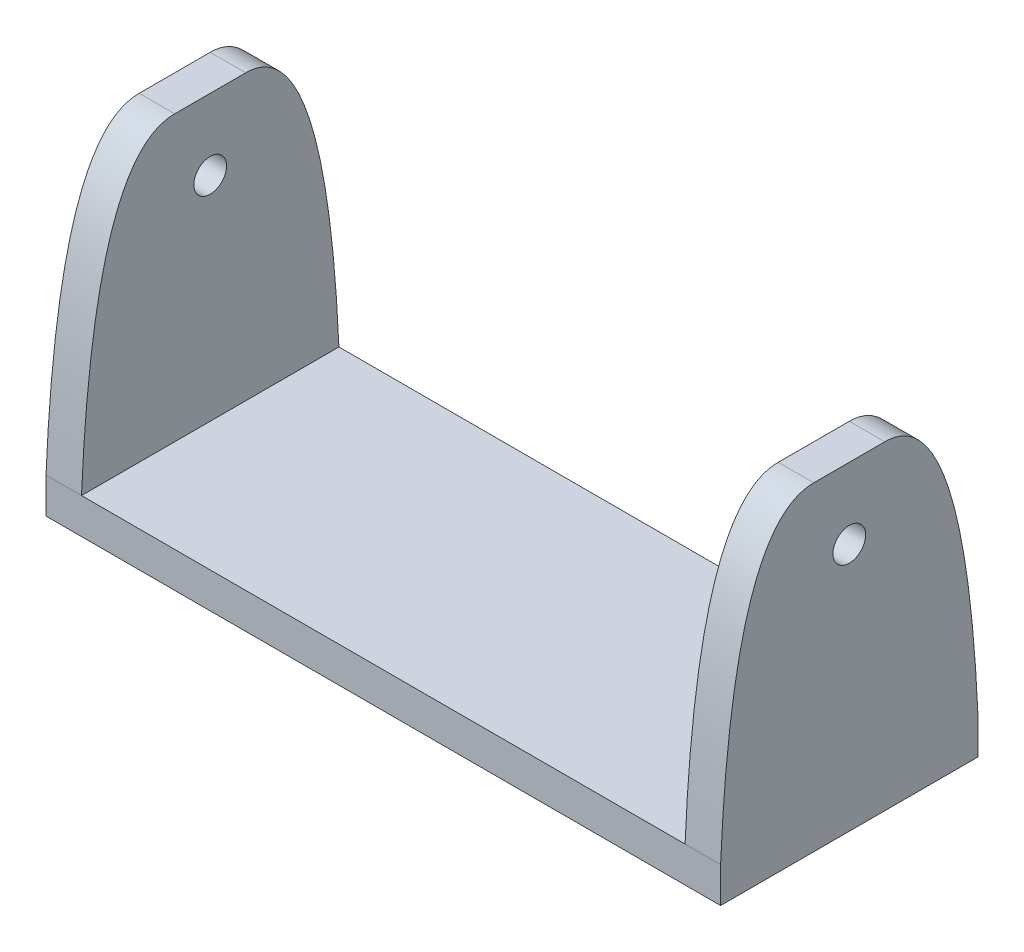
ISO-10303-21;
HEADER;
FILE_DESCRIPTION(('STEP AP214'),'2;1');
FILE_NAME('part.step','',(''),(''),'','','');
FILE_SCHEMA(('AUTOMOTIVE_DESIGN { 1 0 10303 214 1 1 1 1 }'));
ENDSEC;
DATA;
#1=APPLICATION_CONTEXT('core data for automotive mechanical design processes');
#2=APPLICATION_PROTOCOL_DEFINITION('international standard','automotive_design',2000,#1);
#3=PRODUCT_CONTEXT('',#1,'mechanical');
#4=PRODUCT('Part','Part','',(#3));
#5=PRODUCT_RELATED_PRODUCT_CATEGORY('part','',(#4));
#6=PRODUCT_DEFINITION_FORMATION('','',#4);
#7=PRODUCT_DEFINITION_CONTEXT('part definition',#1,'design');
#8=PRODUCT_DEFINITION('design','',#6,#7);
#9=PRODUCT_DEFINITION_SHAPE('','',#8);
#10=(LENGTH_UNIT() NAMED_UNIT(*) SI_UNIT(.MILLI.,.METRE.));
#11=(NAMED_UNIT(*) PLANE_ANGLE_UNIT() SI_UNIT($,.RADIAN.));
#12=(NAMED_UNIT(*) SI_UNIT($,.STERADIAN.) SOLID_ANGLE_UNIT());
#13=UNCERTAINTY_MEASURE_WITH_UNIT(LENGTH_MEASURE(1.E-05),#10,'distance_accuracy_value','');
#14=(GEOMETRIC_REPRESENTATION_CONTEXT(3) GLOBAL_UNCERTAINTY_ASSIGNED_CONTEXT((#13)) GLOBAL_UNIT_ASSIGNED_CONTEXT((#10,
#11,#12)) REPRESENTATION_CONTEXT('',''));
#15=CARTESIAN_POINT('',(0.,0.,0.));
#16=DIRECTION('',(0.,0.,1.));
#17=DIRECTION('',(1.,0.,0.));
#18=AXIS2_PLACEMENT_3D('',#15,#16,#17);
#19=CARTESIAN_POINT('',(0.,36.,0.));
#20=DIRECTION('',(0.,1.,0.));
#21=DIRECTION('',(0.,0.,1.));
#22=AXIS2_PLACEMENT_3D('',#19,#20,#21);
#23=PLANE('',#22);
#24=DIRECTION('',(-1.,0.,0.));
#25=VECTOR('',#24,1.);
#26=CARTESIAN_POINT('',(71.6786282380978,36.,3.99999999999999));
#27=LINE('',#26,#25);
#28=CARTESIAN_POINT('',(-34.,36.,3.99999999999998));
#29=VERTEX_POINT('',#28);
#30=CARTESIAN_POINT('',(-38.,36.,3.99999999999999));
#31=VERTEX_POINT('',#30);
#32=EDGE_CURVE('E119',#29,#31,#27,.T.);
#33=ORIENTED_EDGE('',*,*,#32,.F.);
#34=DIRECTION('',(0.,0.,-1.));
#35=VECTOR('',#34,1.);
#36=CARTESIAN_POINT('',(-34.,36.,-14.5));
#37=LINE('',#36,#35);
#38=CARTESIAN_POINT('',(-34.,36.,-4.));
#39=VERTEX_POINT('',#38);
#40=EDGE_CURVE('E166',#29,#39,#37,.T.);
#41=ORIENTED_EDGE('',*,*,#40,.T.);
#42=DIRECTION('',(-1.,0.,0.));
#43=VECTOR('',#42,1.);
#44=CARTESIAN_POINT('',(71.6786282380978,36.,-4.));
#45=LINE('',#44,#43);
#46=CARTESIAN_POINT('',(-38.,36.,-4.));
#47=VERTEX_POINT('',#46);
#48=EDGE_CURVE('E234',#39,#47,#45,.T.);
#49=ORIENTED_EDGE('',*,*,#48,.T.);
#50=DIRECTION('',(0.,0.,1.));
#51=VECTOR('',#50,1.);
#52=CARTESIAN_POINT('',(-38.,36.,-14.5));
#53=LINE('',#52,#51);
#54=EDGE_CURVE('E176',#47,#31,#53,.T.);
#55=ORIENTED_EDGE('',*,*,#54,.T.);
#56=EDGE_LOOP('',(#33,#41,#49,#55));
#57=FACE_BOUND('',#56,.T.);
#58=ADVANCED_FACE('F39',(#57),#23,.T.);
#59=CARTESIAN_POINT('',(0.,36.,0.));
#60=DIRECTION('',(0.,-1.,0.));
#61=DIRECTION('',(0.,0.,-1.));
#62=AXIS2_PLACEMENT_3D('',#59,#60,#61);
#63=PLANE('',#62);
#64=CARTESIAN_POINT('',(38.,36.,3.99999999999998));
#65=VERTEX_POINT('',#64);
#66=CARTESIAN_POINT('',(34.,36.,3.99999999999999));
#67=VERTEX_POINT('',#66);
#68=EDGE_CURVE('E324',#65,#67,#27,.T.);
#69=ORIENTED_EDGE('',*,*,#68,.F.);
#70=DIRECTION('',(0.,0.,-1.));
#71=VECTOR('',#70,1.);
#72=CARTESIAN_POINT('',(38.,36.,-14.5));
#73=LINE('',#72,#71);
#74=CARTESIAN_POINT('',(38.,36.,-4.));
#75=VERTEX_POINT('',#74);
#76=EDGE_CURVE('E187',#65,#75,#73,.T.);
#77=ORIENTED_EDGE('',*,*,#76,.T.);
#78=CARTESIAN_POINT('',(34.,36.,-4.));
#79=VERTEX_POINT('',#78);
#80=EDGE_CURVE('E226',#75,#79,#45,.T.);
#81=ORIENTED_EDGE('',*,*,#80,.T.);
#82=DIRECTION('',(0.,0.,1.));
#83=VECTOR('',#82,1.);
#84=CARTESIAN_POINT('',(34.,36.,-14.5));
#85=LINE('',#84,#83);
#86=EDGE_CURVE('E177',#79,#67,#85,.T.);
#87=ORIENTED_EDGE('',*,*,#86,.T.);
#88=EDGE_LOOP('',(#69,#77,#81,#87));
#89=FACE_BOUND('',#88,.T.);
#90=ADVANCED_FACE('F264',(#89),#63,.F.);
#91=CARTESIAN_POINT('',(0.,4.,0.));
#92=DIRECTION('',(0.,1.,0.));
#93=DIRECTION('',(0.,0.,1.));
#94=AXIS2_PLACEMENT_3D('',#91,#92,#93);
#95=PLANE('',#94);
#96=DIRECTION('',(1.,0.,0.));
#97=VECTOR('',#96,1.);
#98=CARTESIAN_POINT('',(-38.,4.,14.5));
#99=LINE('',#98,#97);
#100=CARTESIAN_POINT('',(-34.,4.00000000000001,14.5));
#101=VERTEX_POINT('',#100);
#102=CARTESIAN_POINT('',(34.,4.00000000000001,14.5));
#103=VERTEX_POINT('',#102);
#104=EDGE_CURVE('E136',#101,#103,#99,.T.);
#105=ORIENTED_EDGE('',*,*,#104,.T.);
#106=DIRECTION('',(0.,0.,1.));
#107=VECTOR('',#106,1.);
#108=CARTESIAN_POINT('',(34.,4.,-14.5));
#109=LINE('',#108,#107);
#110=CARTESIAN_POINT('',(34.,4.,-14.5));
#111=VERTEX_POINT('',#110);
#112=EDGE_CURVE('E183',#111,#103,#109,.T.);
#113=ORIENTED_EDGE('',*,*,#112,.F.);
#114=DIRECTION('',(-1.,0.,0.));
#115=VECTOR('',#114,1.);
#116=CARTESIAN_POINT('',(-38.,4.,-14.5));
#117=LINE('',#116,#115);
#118=CARTESIAN_POINT('',(-34.,4.,-14.5));
#119=VERTEX_POINT('',#118);
#120=EDGE_CURVE('E155',#111,#119,#117,.T.);
#121=ORIENTED_EDGE('',*,*,#120,.T.);
#122=DIRECTION('',(0.,0.,-1.));
#123=VECTOR('',#122,1.);
#124=CARTESIAN_POINT('',(-34.,4.,-14.5));
#125=LINE('',#124,#123);
#126=EDGE_CURVE('E172',#101,#119,#125,.T.);
#127=ORIENTED_EDGE('',*,*,#126,.F.);
#128=EDGE_LOOP('',(#105,#113,#121,#127));
#129=FACE_BOUND('',#128,.T.);
#130=ADVANCED_FACE('F267',(#129),#95,.T.);
#131=CARTESIAN_POINT('',(38.,4.,-14.5));
#132=DIRECTION('',(-1.,0.,0.));
#133=DIRECTION('',(0.,0.,1.));
#134=AXIS2_PLACEMENT_3D('',#131,#132,#133);
#135=PLANE('',#134);
#136=CARTESIAN_POINT('',(38.,28.,0.));
#137=DIRECTION('',(-1.,0.,0.));
#138=DIRECTION('',(0.,0.,1.));
#139=AXIS2_PLACEMENT_3D('',#136,#137,#138);
#140=CIRCLE('',#139,1.84306645607048);
#141=CARTESIAN_POINT('',(38.,28.,1.84306645607049));
#142=VERTEX_POINT('',#141);
#143=EDGE_CURVE('E311',#142,#142,#140,.T.);
#144=ORIENTED_EDGE('',*,*,#143,.T.);
#145=EDGE_LOOP('',(#144));
#146=FACE_BOUND('',#145,.T.);
#147=ORIENTED_EDGE('',*,*,#76,.F.);
#148=CARTESIAN_POINT('',(38.,36.,3.99999999999999));
#149=CARTESIAN_POINT('',(38.,36.,13.0530073245678));
#150=CARTESIAN_POINT('',(38.,4.00000000000001,14.5));
#151=B_SPLINE_CURVE_WITH_KNOTS('',2,(#148,#149,#150),.UNSPECIFIED.,.F.,.F.,(3,3),(0.,1.),.UNSPECIFIED.);
#152=CARTESIAN_POINT('',(38.,4.00000000000001,14.5));
#153=VERTEX_POINT('',#152);
#154=EDGE_CURVE('E225',#153,#65,#151,.F.);
#155=ORIENTED_EDGE('',*,*,#154,.F.);
#156=DIRECTION('',(0.,-1.,0.));
#157=VECTOR('',#156,1.);
#158=CARTESIAN_POINT('',(38.,4.,14.5));
#159=LINE('',#158,#157);
#160=CARTESIAN_POINT('',(38.,0.,14.5));
#161=VERTEX_POINT('',#160);
#162=EDGE_CURVE('E145',#153,#161,#159,.T.);
#163=ORIENTED_EDGE('',*,*,#162,.T.);
#164=DIRECTION('',(0.,0.,-1.));
#165=VECTOR('',#164,1.);
#166=CARTESIAN_POINT('',(38.,0.,-14.5));
#167=LINE('',#166,#165);
#168=CARTESIAN_POINT('',(38.,0.,-14.5));
#169=VERTEX_POINT('',#168);
#170=EDGE_CURVE('E162',#161,#169,#167,.T.);
#171=ORIENTED_EDGE('',*,*,#170,.T.);
#172=DIRECTION('',(0.,-1.,0.));
#173=VECTOR('',#172,1.);
#174=CARTESIAN_POINT('',(38.,4.,-14.5));
#175=LINE('',#174,#173);
#176=CARTESIAN_POINT('',(38.,4.,-14.5));
#177=VERTEX_POINT('',#176);
#178=EDGE_CURVE('E11',#177,#169,#175,.T.);
#179=ORIENTED_EDGE('',*,*,#178,.F.);
#180=CARTESIAN_POINT('',(38.,4.,-14.5));
#181=CARTESIAN_POINT('',(38.,36.,-13.0530073245678));
#182=CARTESIAN_POINT('',(38.,36.,-4.));
#183=B_SPLINE_CURVE_WITH_KNOTS('',2,(#180,#181,#182),.UNSPECIFIED.,.F.,.F.,(3,3),(0.,1.),.UNSPECIFIED.);
#184=EDGE_CURVE('E125',#75,#177,#183,.F.);
#185=ORIENTED_EDGE('',*,*,#184,.F.);
#186=EDGE_LOOP('',(#147,#155,#163,#171,#179,#185));
#187=FACE_BOUND('',#186,.T.);
#188=ADVANCED_FACE('F41',(#146,#187),#135,.F.);
#189=CARTESIAN_POINT('',(-38.,4.,-14.5));
#190=DIRECTION('',(0.,0.,1.));
#191=DIRECTION('',(1.,0.,0.));
#192=AXIS2_PLACEMENT_3D('',#189,#190,#191);
#193=PLANE('',#192);
#194=DIRECTION('',(0.,-1.,0.));
#195=VECTOR('',#194,1.);
#196=CARTESIAN_POINT('',(-38.,4.,-14.5));
#197=LINE('',#196,#195);
#198=CARTESIAN_POINT('',(-38.,4.,-14.5));
#199=VERTEX_POINT('',#198);
#200=CARTESIAN_POINT('',(-38.,0.,-14.5));
#201=VERTEX_POINT('',#200);
#202=EDGE_CURVE('E49',#199,#201,#197,.T.);
#203=ORIENTED_EDGE('',*,*,#202,.F.);
#204=DIRECTION('',(-1.,0.,0.));
#205=VECTOR('',#204,1.);
#206=CARTESIAN_POINT('',(71.6786282380978,4.,-14.5));
#207=LINE('',#206,#205);
#208=EDGE_CURVE('E233',#119,#199,#207,.T.);
#209=ORIENTED_EDGE('',*,*,#208,.F.);
#210=ORIENTED_EDGE('',*,*,#120,.F.);
#211=EDGE_CURVE('E235',#177,#111,#207,.T.);
#212=ORIENTED_EDGE('',*,*,#211,.F.);
#213=ORIENTED_EDGE('',*,*,#178,.T.);
#214=DIRECTION('',(-1.,0.,0.));
#215=VECTOR('',#214,1.);
#216=CARTESIAN_POINT('',(-38.,0.,-14.5));
#217=LINE('',#216,#215);
#218=EDGE_CURVE('E158',#169,#201,#217,.T.);
#219=ORIENTED_EDGE('',*,*,#218,.T.);
#220=EDGE_LOOP('',(#203,#209,#210,#212,#213,#219));
#221=FACE_BOUND('',#220,.T.);
#222=ADVANCED_FACE('F290',(#221),#193,.F.);
#223=CARTESIAN_POINT('',(-38.,4.,-14.5));
#224=DIRECTION('',(1.,0.,0.));
#225=DIRECTION('',(0.,0.,-1.));
#226=AXIS2_PLACEMENT_3D('',#223,#224,#225);
#227=PLANE('',#226);
#228=CARTESIAN_POINT('',(-38.,28.,0.));
#229=DIRECTION('',(-1.,0.,0.));
#230=DIRECTION('',(0.,0.,1.));
#231=AXIS2_PLACEMENT_3D('',#228,#229,#230);
#232=CIRCLE('',#231,1.84306645607048);
#233=CARTESIAN_POINT('',(-38.,28.,1.84306645607048));
#234=VERTEX_POINT('',#233);
#235=EDGE_CURVE('E314',#234,#234,#232,.T.);
#236=ORIENTED_EDGE('',*,*,#235,.F.);
#237=EDGE_LOOP('',(#236));
#238=FACE_BOUND('',#237,.T.);
#239=DIRECTION('',(0.,-1.,0.));
#240=VECTOR('',#239,1.);
#241=CARTESIAN_POINT('',(-38.,4.,14.5));
#242=LINE('',#241,#240);
#243=CARTESIAN_POINT('',(-38.,4.00000000000001,14.5));
#244=VERTEX_POINT('',#243);
#245=CARTESIAN_POINT('',(-38.,0.,14.5));
#246=VERTEX_POINT('',#245);
#247=EDGE_CURVE('E132',#244,#246,#242,.T.);
#248=ORIENTED_EDGE('',*,*,#247,.F.);
#249=CARTESIAN_POINT('',(-38.,36.,3.99999999999999));
#250=CARTESIAN_POINT('',(-38.,36.,13.0530073245678));
#251=CARTESIAN_POINT('',(-38.,4.00000000000001,14.5));
#252=B_SPLINE_CURVE_WITH_KNOTS('',2,(#249,#250,#251),.UNSPECIFIED.,.F.,.F.,(3,3),(0.,1.),.UNSPECIFIED.);
#253=EDGE_CURVE('E115',#31,#244,#252,.T.);
#254=ORIENTED_EDGE('',*,*,#253,.F.);
#255=ORIENTED_EDGE('',*,*,#54,.F.);
#256=CARTESIAN_POINT('',(-38.,4.,-14.5));
#257=CARTESIAN_POINT('',(-38.,36.,-13.0530073245678));
#258=CARTESIAN_POINT('',(-38.,36.,-4.));
#259=B_SPLINE_CURVE_WITH_KNOTS('',2,(#256,#257,#258),.UNSPECIFIED.,.F.,.F.,(3,3),(0.,1.),.UNSPECIFIED.);
#260=EDGE_CURVE('E64',#199,#47,#259,.T.);
#261=ORIENTED_EDGE('',*,*,#260,.F.);
#262=ORIENTED_EDGE('',*,*,#202,.T.);
#263=DIRECTION('',(0.,0.,1.));
#264=VECTOR('',#263,1.);
#265=CARTESIAN_POINT('',(-38.,0.,-14.5));
#266=LINE('',#265,#264);
#267=EDGE_CURVE('E142',#201,#246,#266,.T.);
#268=ORIENTED_EDGE('',*,*,#267,.T.);
#269=EDGE_LOOP('',(#248,#254,#255,#261,#262,#268));
#270=FACE_BOUND('',#269,.T.);
#271=ADVANCED_FACE('F140',(#238,#270),#227,.F.);
#272=CARTESIAN_POINT('',(-38.,4.,14.5));
#273=DIRECTION('',(0.,0.,-1.));
#274=DIRECTION('',(-1.,0.,0.));
#275=AXIS2_PLACEMENT_3D('',#272,#273,#274);
#276=PLANE('',#275);
#277=ORIENTED_EDGE('',*,*,#162,.F.);
#278=DIRECTION('',(-1.,0.,0.));
#279=VECTOR('',#278,1.);
#280=CARTESIAN_POINT('',(71.6786282380978,4.00000000000001,14.5));
#281=LINE('',#280,#279);
#282=EDGE_CURVE('E138',#153,#103,#281,.T.);
#283=ORIENTED_EDGE('',*,*,#282,.T.);
#284=ORIENTED_EDGE('',*,*,#104,.F.);
#285=EDGE_CURVE('E118',#101,#244,#281,.T.);
#286=ORIENTED_EDGE('',*,*,#285,.T.);
#287=ORIENTED_EDGE('',*,*,#247,.T.);
#288=DIRECTION('',(1.,0.,0.));
#289=VECTOR('',#288,1.);
#290=CARTESIAN_POINT('',(-38.,0.,14.5));
#291=LINE('',#290,#289);
#292=EDGE_CURVE('E152',#246,#161,#291,.T.);
#293=ORIENTED_EDGE('',*,*,#292,.T.);
#294=EDGE_LOOP('',(#277,#283,#284,#286,#287,#293));
#295=FACE_BOUND('',#294,.T.);
#296=ADVANCED_FACE('F130',(#295),#276,.F.);
#297=CARTESIAN_POINT('',(0.,0.,0.));
#298=DIRECTION('',(0.,1.,0.));
#299=DIRECTION('',(0.,0.,1.));
#300=AXIS2_PLACEMENT_3D('',#297,#298,#299);
#301=PLANE('',#300);
#302=ORIENTED_EDGE('',*,*,#170,.F.);
#303=ORIENTED_EDGE('',*,*,#292,.F.);
#304=ORIENTED_EDGE('',*,*,#267,.F.);
#305=ORIENTED_EDGE('',*,*,#218,.F.);
#306=EDGE_LOOP('',(#302,#303,#304,#305));
#307=FACE_BOUND('',#306,.T.);
#308=ADVANCED_FACE('F279',(#307),#301,.F.);
#309=CARTESIAN_POINT('',(-34.,36.,-14.5));
#310=DIRECTION('',(-1.,0.,0.));
#311=DIRECTION('',(0.,0.,1.));
#312=AXIS2_PLACEMENT_3D('',#309,#310,#311);
#313=PLANE('',#312);
#314=CARTESIAN_POINT('',(-34.,28.,0.));
#315=DIRECTION('',(-1.,0.,0.));
#316=DIRECTION('',(0.,0.,1.));
#317=AXIS2_PLACEMENT_3D('',#314,#315,#316);
#318=CIRCLE('',#317,1.84306645607048);
#319=CARTESIAN_POINT('',(-34.,28.,1.84306645607048));
#320=VERTEX_POINT('',#319);
#321=EDGE_CURVE('E242',#320,#320,#318,.T.);
#322=ORIENTED_EDGE('',*,*,#321,.T.);
#323=EDGE_LOOP('',(#322));
#324=FACE_BOUND('',#323,.T.);
#325=ORIENTED_EDGE('',*,*,#40,.F.);
#326=CARTESIAN_POINT('',(-34.,36.,3.99999999999999));
#327=CARTESIAN_POINT('',(-34.,36.,13.0530073245678));
#328=CARTESIAN_POINT('',(-34.,4.00000000000001,14.5));
#329=B_SPLINE_CURVE_WITH_KNOTS('',2,(#326,#327,#328),.UNSPECIFIED.,.F.,.F.,(3,3),(0.,1.),.UNSPECIFIED.);
#330=EDGE_CURVE('E56',#29,#101,#329,.T.);
#331=ORIENTED_EDGE('',*,*,#330,.T.);
#332=ORIENTED_EDGE('',*,*,#126,.T.);
#333=CARTESIAN_POINT('',(-34.,4.,-14.5));
#334=CARTESIAN_POINT('',(-34.,36.,-13.0530073245678));
#335=CARTESIAN_POINT('',(-34.,36.,-4.));
#336=B_SPLINE_CURVE_WITH_KNOTS('',2,(#333,#334,#335),.UNSPECIFIED.,.F.,.F.,(3,3),(0.,1.),.UNSPECIFIED.);
#337=EDGE_CURVE('E207',#119,#39,#336,.T.);
#338=ORIENTED_EDGE('',*,*,#337,.T.);
#339=EDGE_LOOP('',(#325,#331,#332,#338));
#340=FACE_BOUND('',#339,.T.);
#341=ADVANCED_FACE('F272',(#324,#340),#313,.F.);
#342=CARTESIAN_POINT('',(34.,36.,-14.5));
#343=DIRECTION('',(1.,0.,0.));
#344=DIRECTION('',(0.,0.,-1.));
#345=AXIS2_PLACEMENT_3D('',#342,#343,#344);
#346=PLANE('',#345);
#347=CARTESIAN_POINT('',(34.,28.,0.));
#348=DIRECTION('',(1.,0.,0.));
#349=DIRECTION('',(0.,0.,-1.));
#350=AXIS2_PLACEMENT_3D('',#347,#348,#349);
#351=CIRCLE('',#350,1.84306645607048);
#352=CARTESIAN_POINT('',(34.,28.,-1.84306645607048));
#353=VERTEX_POINT('',#352);
#354=EDGE_CURVE('E43',#353,#353,#351,.T.);
#355=ORIENTED_EDGE('',*,*,#354,.T.);
#356=EDGE_LOOP('',(#355));
#357=FACE_BOUND('',#356,.T.);
#358=ORIENTED_EDGE('',*,*,#112,.T.);
#359=CARTESIAN_POINT('',(34.,36.,3.99999999999999));
#360=CARTESIAN_POINT('',(34.,36.,13.0530073245678));
#361=CARTESIAN_POINT('',(34.,4.00000000000001,14.5));
#362=B_SPLINE_CURVE_WITH_KNOTS('',2,(#359,#360,#361),.UNSPECIFIED.,.F.,.F.,(3,3),(0.,1.),.UNSPECIFIED.);
#363=EDGE_CURVE('E198',#103,#67,#362,.F.);
#364=ORIENTED_EDGE('',*,*,#363,.T.);
#365=ORIENTED_EDGE('',*,*,#86,.F.);
#366=CARTESIAN_POINT('',(34.,4.,-14.5));
#367=CARTESIAN_POINT('',(34.,36.,-13.0530073245678));
#368=CARTESIAN_POINT('',(34.,36.,-4.));
#369=B_SPLINE_CURVE_WITH_KNOTS('',2,(#366,#367,#368),.UNSPECIFIED.,.F.,.F.,(3,3),(0.,1.),.UNSPECIFIED.);
#370=EDGE_CURVE('E216',#79,#111,#369,.F.);
#371=ORIENTED_EDGE('',*,*,#370,.T.);
#372=EDGE_LOOP('',(#358,#364,#365,#371));
#373=FACE_BOUND('',#372,.T.);
#374=ADVANCED_FACE('F269',(#357,#373),#346,.F.);
#375=CARTESIAN_POINT('',(71.6786282380978,4.,-14.5));
#376=CARTESIAN_POINT('',(71.6786282380978,36.,-13.0530073245678));
#377=CARTESIAN_POINT('',(71.6786282380978,36.,-4.));
#378=B_SPLINE_CURVE_WITH_KNOTS('',2,(#375,#376,#377),.UNSPECIFIED.,.F.,.F.,(3,3),(0.,1.),.UNSPECIFIED.);
#379=DIRECTION('',(-1.,0.,0.));
#380=VECTOR('',#379,1.);
#381=SURFACE_OF_LINEAR_EXTRUSION('',#378,#380);
#382=ORIENTED_EDGE('',*,*,#80,.F.);
#383=ORIENTED_EDGE('',*,*,#184,.T.);
#384=ORIENTED_EDGE('',*,*,#211,.T.);
#385=ORIENTED_EDGE('',*,*,#370,.F.);
#386=EDGE_LOOP('',(#382,#383,#384,#385));
#387=FACE_BOUND('',#386,.T.);
#388=ADVANCED_FACE('F261',(#387),#381,.F.);
#389=CARTESIAN_POINT('',(71.6786282380978,36.,3.99999999999999));
#390=CARTESIAN_POINT('',(71.6786282380978,36.,13.0530073245678));
#391=CARTESIAN_POINT('',(71.6786282380978,4.00000000000001,14.5));
#392=B_SPLINE_CURVE_WITH_KNOTS('',2,(#389,#390,#391),.UNSPECIFIED.,.F.,.F.,(3,3),(0.,1.),.UNSPECIFIED.);
#393=DIRECTION('',(-1.,0.,0.));
#394=VECTOR('',#393,1.);
#395=SURFACE_OF_LINEAR_EXTRUSION('',#392,#394);
#396=ORIENTED_EDGE('',*,*,#282,.F.);
#397=ORIENTED_EDGE('',*,*,#154,.T.);
#398=ORIENTED_EDGE('',*,*,#68,.T.);
#399=ORIENTED_EDGE('',*,*,#363,.F.);
#400=EDGE_LOOP('',(#396,#397,#398,#399));
#401=FACE_BOUND('',#400,.T.);
#402=ADVANCED_FACE('F260',(#401),#395,.F.);
#403=ORIENTED_EDGE('',*,*,#208,.T.);
#404=ORIENTED_EDGE('',*,*,#260,.T.);
#405=ORIENTED_EDGE('',*,*,#48,.F.);
#406=ORIENTED_EDGE('',*,*,#337,.F.);
#407=EDGE_LOOP('',(#403,#404,#405,#406));
#408=FACE_BOUND('',#407,.T.);
#409=ADVANCED_FACE('F256',(#408),#381,.F.);
#410=ORIENTED_EDGE('',*,*,#32,.T.);
#411=ORIENTED_EDGE('',*,*,#253,.T.);
#412=ORIENTED_EDGE('',*,*,#285,.F.);
#413=ORIENTED_EDGE('',*,*,#330,.F.);
#414=EDGE_LOOP('',(#410,#411,#412,#413));
#415=FACE_BOUND('',#414,.T.);
#416=ADVANCED_FACE('F117',(#415),#395,.F.);
#417=CARTESIAN_POINT('',(38.,28.,0.));
#418=DIRECTION('',(-1.,0.,0.));
#419=DIRECTION('',(0.,0.,1.));
#420=AXIS2_PLACEMENT_3D('',#417,#418,#419);
#421=CYLINDRICAL_SURFACE('',#420,1.84306645607048);
#422=ORIENTED_EDGE('',*,*,#143,.F.);
#423=EDGE_LOOP('',(#422));
#424=FACE_BOUND('',#423,.T.);
#425=ORIENTED_EDGE('',*,*,#354,.F.);
#426=EDGE_LOOP('',(#425));
#427=FACE_BOUND('',#426,.T.);
#428=ADVANCED_FACE('F364',(#424,#427),#421,.F.);
#429=ORIENTED_EDGE('',*,*,#235,.T.);
#430=EDGE_LOOP('',(#429));
#431=FACE_BOUND('',#430,.T.);
#432=ORIENTED_EDGE('',*,*,#321,.F.);
#433=EDGE_LOOP('',(#432));
#434=FACE_BOUND('',#433,.T.);
#435=ADVANCED_FACE('F368',(#431,#434),#421,.F.);
#436=CLOSED_SHELL('',(#58,#90,#130,#188,#222,#271,#296,#308,#341,#374,#388,#402,#409,#416,#428,#435));
#437=MANIFOLD_SOLID_BREP('B2',#436);
#438=ADVANCED_BREP_SHAPE_REPRESENTATION('',(#18,#437),#14);
#439=SHAPE_DEFINITION_REPRESENTATION(#9,#438);
ENDSEC;
END-ISO-10303-21;
